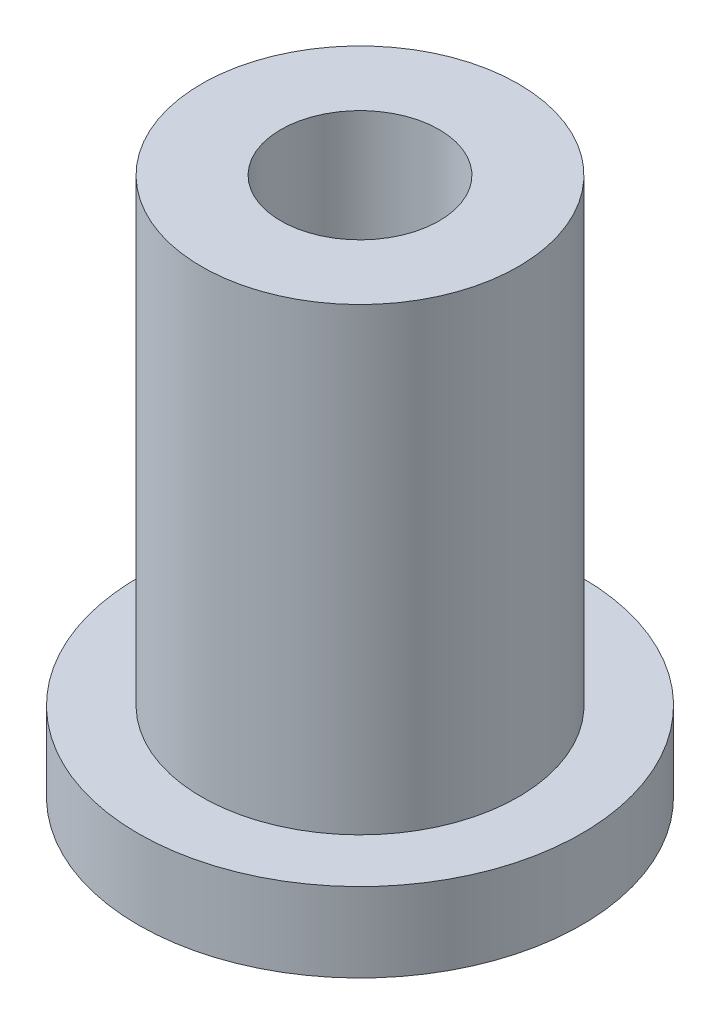
ISO-10303-21;
HEADER;
FILE_DESCRIPTION(('STEP AP214'),'2;1');
FILE_NAME('part.step','',(''),(''),'','','');
FILE_SCHEMA(('AUTOMOTIVE_DESIGN { 1 0 10303 214 1 1 1 1 }'));
ENDSEC;
DATA;
#1=APPLICATION_CONTEXT('core data for automotive mechanical design processes');
#2=APPLICATION_PROTOCOL_DEFINITION('international standard','automotive_design',2000,#1);
#3=PRODUCT_CONTEXT('',#1,'mechanical');
#4=PRODUCT('Part','Part','',(#3));
#5=PRODUCT_RELATED_PRODUCT_CATEGORY('part','',(#4));
#6=PRODUCT_DEFINITION_FORMATION('','',#4);
#7=PRODUCT_DEFINITION_CONTEXT('part definition',#1,'design');
#8=PRODUCT_DEFINITION('design','',#6,#7);
#9=PRODUCT_DEFINITION_SHAPE('','',#8);
#10=(LENGTH_UNIT() NAMED_UNIT(*) SI_UNIT(.MILLI.,.METRE.));
#11=(NAMED_UNIT(*) PLANE_ANGLE_UNIT() SI_UNIT($,.RADIAN.));
#12=(NAMED_UNIT(*) SI_UNIT($,.STERADIAN.) SOLID_ANGLE_UNIT());
#13=UNCERTAINTY_MEASURE_WITH_UNIT(LENGTH_MEASURE(1.E-05),#10,'distance_accuracy_value','');
#14=(GEOMETRIC_REPRESENTATION_CONTEXT(3) GLOBAL_UNCERTAINTY_ASSIGNED_CONTEXT((#13)) GLOBAL_UNIT_ASSIGNED_CONTEXT((#10,
#11,#12)) REPRESENTATION_CONTEXT('',''));
#15=CARTESIAN_POINT('',(0.,0.,0.));
#16=DIRECTION('',(0.,0.,1.));
#17=DIRECTION('',(1.,0.,0.));
#18=AXIS2_PLACEMENT_3D('',#15,#16,#17);
#19=CARTESIAN_POINT('',(-14.,0.,0.));
#20=DIRECTION('',(0.,1.,0.));
#21=DIRECTION('',(0.,0.,1.));
#22=AXIS2_PLACEMENT_3D('',#19,#20,#21);
#23=PLANE('',#22);
#24=CARTESIAN_POINT('',(0.,0.,0.));
#25=DIRECTION('',(0.,-1.,0.));
#26=DIRECTION('',(0.,0.,-1.));
#27=AXIS2_PLACEMENT_3D('',#24,#25,#26);
#28=CIRCLE('',#27,5.);
#29=CARTESIAN_POINT('',(0.,0.,-5.));
#30=VERTEX_POINT('',#29);
#31=EDGE_CURVE('E10',#30,#30,#28,.T.);
#32=ORIENTED_EDGE('',*,*,#31,.F.);
#33=EDGE_LOOP('',(#32));
#34=FACE_BOUND('',#33,.T.);
#35=CARTESIAN_POINT('',(0.,0.,0.));
#36=DIRECTION('',(0.,-1.,0.));
#37=DIRECTION('',(0.,0.,-1.));
#38=AXIS2_PLACEMENT_3D('',#35,#36,#37);
#39=CIRCLE('',#38,14.);
#40=CARTESIAN_POINT('',(0.,0.,-14.));
#41=VERTEX_POINT('',#40);
#42=EDGE_CURVE('E53',#41,#41,#39,.T.);
#43=ORIENTED_EDGE('',*,*,#42,.T.);
#44=EDGE_LOOP('',(#43));
#45=FACE_BOUND('',#44,.T.);
#46=ADVANCED_FACE('F31',(#34,#45),#23,.F.);
#47=CARTESIAN_POINT('',(0.,0.,0.));
#48=DIRECTION('',(0.,-1.,0.));
#49=DIRECTION('',(0.,0.,-1.));
#50=AXIS2_PLACEMENT_3D('',#47,#48,#49);
#51=CYLINDRICAL_SURFACE('',#50,5.);
#52=CARTESIAN_POINT('',(0.,34.,0.));
#53=DIRECTION('',(0.,-1.,0.));
#54=DIRECTION('',(0.,0.,-1.));
#55=AXIS2_PLACEMENT_3D('',#52,#53,#54);
#56=CIRCLE('',#55,5.);
#57=CARTESIAN_POINT('',(0.,34.,-5.));
#58=VERTEX_POINT('',#57);
#59=EDGE_CURVE('E37',#58,#58,#56,.T.);
#60=ORIENTED_EDGE('',*,*,#59,.F.);
#61=EDGE_LOOP('',(#60));
#62=FACE_BOUND('',#61,.T.);
#63=ORIENTED_EDGE('',*,*,#31,.T.);
#64=EDGE_LOOP('',(#63));
#65=FACE_BOUND('',#64,.T.);
#66=ADVANCED_FACE('F78',(#62,#65),#51,.F.);
#67=CARTESIAN_POINT('',(-5.,34.,0.));
#68=DIRECTION('',(0.,-1.,0.));
#69=DIRECTION('',(0.,0.,-1.));
#70=AXIS2_PLACEMENT_3D('',#67,#68,#69);
#71=PLANE('',#70);
#72=CARTESIAN_POINT('',(0.,34.,0.));
#73=DIRECTION('',(0.,-1.,0.));
#74=DIRECTION('',(0.,0.,-1.));
#75=AXIS2_PLACEMENT_3D('',#72,#73,#74);
#76=CIRCLE('',#75,10.);
#77=CARTESIAN_POINT('',(0.,34.,-10.));
#78=VERTEX_POINT('',#77);
#79=EDGE_CURVE('E41',#78,#78,#76,.T.);
#80=ORIENTED_EDGE('',*,*,#79,.F.);
#81=EDGE_LOOP('',(#80));
#82=FACE_BOUND('',#81,.T.);
#83=ORIENTED_EDGE('',*,*,#59,.T.);
#84=EDGE_LOOP('',(#83));
#85=FACE_BOUND('',#84,.T.);
#86=ADVANCED_FACE('F73',(#82,#85),#71,.F.);
#87=CARTESIAN_POINT('',(0.,0.,0.));
#88=DIRECTION('',(0.,-1.,0.));
#89=DIRECTION('',(0.,0.,-1.));
#90=AXIS2_PLACEMENT_3D('',#87,#88,#89);
#91=CYLINDRICAL_SURFACE('',#90,10.);
#92=CARTESIAN_POINT('',(0.,5.,0.));
#93=DIRECTION('',(0.,-1.,0.));
#94=DIRECTION('',(0.,0.,-1.));
#95=AXIS2_PLACEMENT_3D('',#92,#93,#94);
#96=CIRCLE('',#95,10.);
#97=CARTESIAN_POINT('',(0.,5.,-10.));
#98=VERTEX_POINT('',#97);
#99=EDGE_CURVE('E45',#98,#98,#96,.T.);
#100=ORIENTED_EDGE('',*,*,#99,.F.);
#101=EDGE_LOOP('',(#100));
#102=FACE_BOUND('',#101,.T.);
#103=ORIENTED_EDGE('',*,*,#79,.T.);
#104=EDGE_LOOP('',(#103));
#105=FACE_BOUND('',#104,.T.);
#106=ADVANCED_FACE('F67',(#102,#105),#91,.T.);
#107=CARTESIAN_POINT('',(-10.,5.,0.));
#108=DIRECTION('',(0.,-1.,0.));
#109=DIRECTION('',(0.,0.,-1.));
#110=AXIS2_PLACEMENT_3D('',#107,#108,#109);
#111=PLANE('',#110);
#112=CARTESIAN_POINT('',(0.,5.,0.));
#113=DIRECTION('',(0.,-1.,0.));
#114=DIRECTION('',(0.,0.,-1.));
#115=AXIS2_PLACEMENT_3D('',#112,#113,#114);
#116=CIRCLE('',#115,14.);
#117=CARTESIAN_POINT('',(0.,5.,-14.));
#118=VERTEX_POINT('',#117);
#119=EDGE_CURVE('E50',#118,#118,#116,.T.);
#120=ORIENTED_EDGE('',*,*,#119,.F.);
#121=EDGE_LOOP('',(#120));
#122=FACE_BOUND('',#121,.T.);
#123=ORIENTED_EDGE('',*,*,#99,.T.);
#124=EDGE_LOOP('',(#123));
#125=FACE_BOUND('',#124,.T.);
#126=ADVANCED_FACE('F61',(#122,#125),#111,.F.);
#127=CARTESIAN_POINT('',(0.,0.,0.));
#128=DIRECTION('',(0.,-1.,0.));
#129=DIRECTION('',(0.,0.,-1.));
#130=AXIS2_PLACEMENT_3D('',#127,#128,#129);
#131=CYLINDRICAL_SURFACE('',#130,14.);
#132=ORIENTED_EDGE('',*,*,#42,.F.);
#133=EDGE_LOOP('',(#132));
#134=FACE_BOUND('',#133,.T.);
#135=ORIENTED_EDGE('',*,*,#119,.T.);
#136=EDGE_LOOP('',(#135));
#137=FACE_BOUND('',#136,.T.);
#138=ADVANCED_FACE('F58',(#134,#137),#131,.T.);
#139=CLOSED_SHELL('',(#46,#66,#86,#106,#126,#138));
#140=MANIFOLD_SOLID_BREP('B2',#139);
#141=ADVANCED_BREP_SHAPE_REPRESENTATION('',(#18,#140),#14);
#142=SHAPE_DEFINITION_REPRESENTATION(#9,#141);
ENDSEC;
END-ISO-10303-21;
